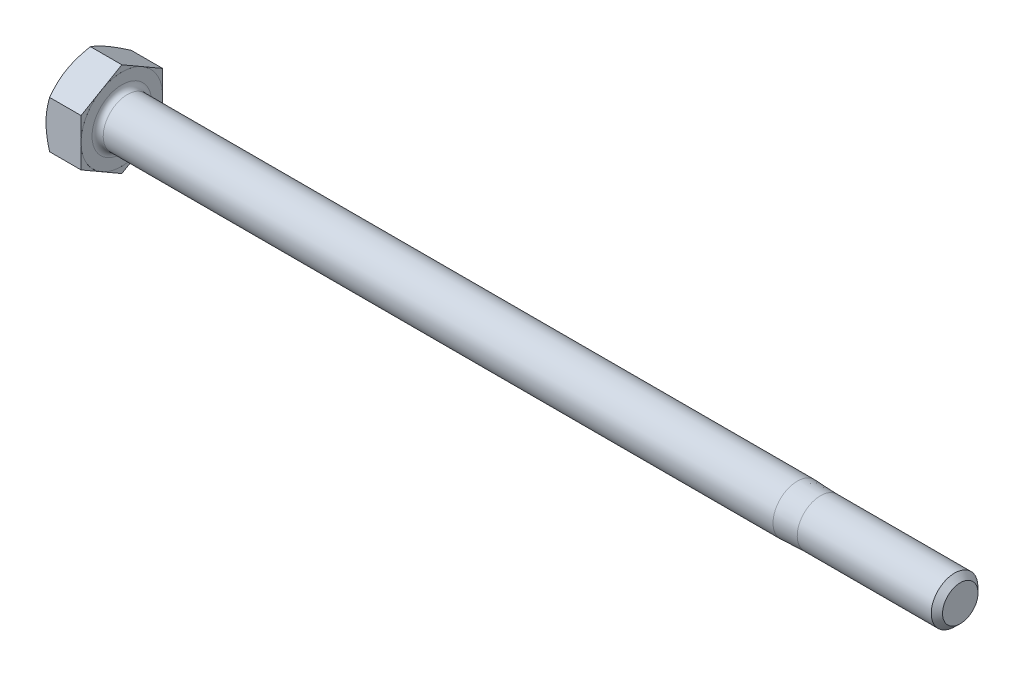
ISO-10303-21;
HEADER;
FILE_DESCRIPTION(('STEP AP214'),'2;1');
FILE_NAME('part.step','',(''),(''),'','','');
FILE_SCHEMA(('AUTOMOTIVE_DESIGN { 1 0 10303 214 1 1 1 1 }'));
ENDSEC;
DATA;
#1=APPLICATION_CONTEXT('core data for automotive mechanical design processes');
#2=APPLICATION_PROTOCOL_DEFINITION('international standard','automotive_design',2000,#1);
#3=PRODUCT_CONTEXT('',#1,'mechanical');
#4=PRODUCT('Part','Part','',(#3));
#5=PRODUCT_RELATED_PRODUCT_CATEGORY('part','',(#4));
#6=PRODUCT_DEFINITION_FORMATION('','',#4);
#7=PRODUCT_DEFINITION_CONTEXT('part definition',#1,'design');
#8=PRODUCT_DEFINITION('design','',#6,#7);
#9=PRODUCT_DEFINITION_SHAPE('','',#8);
#10=(LENGTH_UNIT() NAMED_UNIT(*) SI_UNIT(.MILLI.,.METRE.));
#11=(NAMED_UNIT(*) PLANE_ANGLE_UNIT() SI_UNIT($,.RADIAN.));
#12=(NAMED_UNIT(*) SI_UNIT($,.STERADIAN.) SOLID_ANGLE_UNIT());
#13=UNCERTAINTY_MEASURE_WITH_UNIT(LENGTH_MEASURE(1.E-05),#10,'distance_accuracy_value','');
#14=(GEOMETRIC_REPRESENTATION_CONTEXT(3) GLOBAL_UNCERTAINTY_ASSIGNED_CONTEXT((#13)) GLOBAL_UNIT_ASSIGNED_CONTEXT((#10,
#11,#12)) REPRESENTATION_CONTEXT('',''));
#15=CARTESIAN_POINT('',(0.,0.,0.));
#16=DIRECTION('',(0.,0.,1.));
#17=DIRECTION('',(1.,0.,0.));
#18=AXIS2_PLACEMENT_3D('',#15,#16,#17);
#19=CARTESIAN_POINT('',(-4.77529999999999,3.21156860739421,-5.5626));
#20=DIRECTION('',(0.,-0.866025403784439,0.499999999999999));
#21=DIRECTION('',(0.,-0.499999999999999,-0.866025403784439));
#22=AXIS2_PLACEMENT_3D('',#19,#20,#21);
#23=PLANE('',#22);
#24=CARTESIAN_POINT('',(-4.27840193892987,6.42325268484225,0.000200000000006919));
#25=CARTESIAN_POINT('',(-4.31915379774488,6.3526585812079,-0.122072574209484));
#26=CARTESIAN_POINT('',(-4.35805622469129,6.28180126837449,-0.244801040124756));
#27=CARTESIAN_POINT('',(-4.43165283843947,6.13951120287092,-0.491254662989237));
#28=CARTESIAN_POINT('',(-4.46634520986097,6.06807821602764,-0.614980225538191));
#29=CARTESIAN_POINT('',(-4.56342629893316,5.85263550648139,-0.988137944592613));
#30=CARTESIAN_POINT('',(-4.61864515807664,5.70777535201368,-1.23904309212295));
#31=CARTESIAN_POINT('',(-4.68339621381849,5.49099476252075,-1.61451808721945));
#32=CARTESIAN_POINT('',(-4.70184200165708,5.41972205873199,-1.73796603137439));
#33=CARTESIAN_POINT('',(-4.73277310833255,5.27685459691414,-1.98541973399131));
#34=CARTESIAN_POINT('',(-4.74525895381101,5.20525986790488,-2.10942544218947));
#35=CARTESIAN_POINT('',(-4.76395197006054,5.06194605565757,-2.3576522464282));
#36=CARTESIAN_POINT('',(-4.77016626659417,4.9902272065059,-2.48187293701927));
#37=CARTESIAN_POINT('',(-4.77618959935911,4.84672720555795,-2.73042222954729));
#38=CARTESIAN_POINT('',(-4.77599883344831,4.77494605575469,-2.85475082803224));
#39=CARTESIAN_POINT('',(-4.76667189863659,4.57828637012705,-3.19537539533984));
#40=CARTESIAN_POINT('',(-4.75101260446494,4.4534722013835,-3.41155987710815));
#41=CARTESIAN_POINT('',(-4.70135567661841,4.20467287416473,-3.84249295274001));
#42=CARTESIAN_POINT('',(-4.66734106857655,4.08068859075411,-4.05724003094722));
#43=CARTESIAN_POINT('',(-4.58231395859033,3.83138850679899,-4.48904044268869));
#44=CARTESIAN_POINT('',(-4.53094118606261,3.70610416511176,-4.70603928788378));
#45=CARTESIAN_POINT('',(-4.41434554300041,3.45740388365365,-5.13680081122591));
#46=CARTESIAN_POINT('',(-4.34915006238295,3.33398475856357,-5.35056900650763));
#47=CARTESIAN_POINT('',(-4.27840193892987,3.21145313734037,-5.56279999999999));
#48=B_SPLINE_CURVE_WITH_KNOTS('',3,(#24,#25,#26,#27,#28,#29,#30,#31,#32,#33,#34,#35,#36,#37,#38,
#39,#40,#41,#42,#43,#44,#45,#46,#47),.UNSPECIFIED.,.F.,.F.,(4,2,2,2,2,2,2,2,2,2,2,4),(0.,
0.44082011856227,0.881829648847399,1.76568130465016,2.19678242164486,2.62784543796583,
3.05841812523867,3.48897751176352,4.23854798324166,4.98881282275669,5.75571809391027,
6.52111769989992),.UNSPECIFIED.);
#49=CARTESIAN_POINT('',(-4.27846860739423,6.4231372147884,0.));
#50=VERTEX_POINT('',#49);
#51=CARTESIAN_POINT('',(-4.77530000000001,4.81735291109132,-2.7813));
#52=VERTEX_POINT('',#51);
#53=EDGE_CURVE('E226',#50,#52,#48,.T.);
#54=ORIENTED_EDGE('',*,*,#53,.F.);
#55=DIRECTION('',(1.,0.,0.));
#56=VECTOR('',#55,1.);
#57=CARTESIAN_POINT('',(-4.77529999999999,6.42313721478842,0.));
#58=LINE('',#57,#56);
#59=CARTESIAN_POINT('',(-9.99999999944363E-05,6.42313721478842,0.));
#60=VERTEX_POINT('',#59);
#61=EDGE_CURVE('E149',#50,#60,#58,.T.);
#62=ORIENTED_EDGE('',*,*,#61,.T.);
#63=DIRECTION('',(0.,-0.499999999999999,-0.866025403784439));
#64=VECTOR('',#63,1.);
#65=CARTESIAN_POINT('',(-9.99999999940308E-05,3.21156860739421,-5.5626));
#66=LINE('',#65,#64);
#67=CARTESIAN_POINT('',(-9.99999999942335E-05,4.81735291109131,-2.78129999999999));
#68=VERTEX_POINT('',#67);
#69=EDGE_CURVE('E233',#60,#68,#66,.T.);
#70=ORIENTED_EDGE('',*,*,#69,.T.);
#71=CARTESIAN_POINT('',(-9.99999999940308E-05,3.21156860739421,-5.5626));
#72=VERTEX_POINT('',#71);
#73=EDGE_CURVE('E312',#68,#72,#66,.T.);
#74=ORIENTED_EDGE('',*,*,#73,.T.);
#75=DIRECTION('',(1.,0.,0.));
#76=VECTOR('',#75,1.);
#77=CARTESIAN_POINT('',(-4.77529999999999,3.21156860739421,-5.5626));
#78=LINE('',#77,#76);
#79=CARTESIAN_POINT('',(-4.27846860739423,3.21156860739418,-5.5626));
#80=VERTEX_POINT('',#79);
#81=EDGE_CURVE('E160',#80,#72,#78,.T.);
#82=ORIENTED_EDGE('',*,*,#81,.F.);
#83=EDGE_CURVE('E219',#52,#80,#48,.T.);
#84=ORIENTED_EDGE('',*,*,#83,.F.);
#85=EDGE_LOOP('',(#54,#62,#70,#74,#82,#84));
#86=FACE_BOUND('',#85,.T.);
#87=ADVANCED_FACE('F36',(#86),#23,.F.);
#88=CARTESIAN_POINT('',(-4.77529999999999,-3.21156860739421,-5.5626));
#89=DIRECTION('',(0.,0.,1.));
#90=DIRECTION('',(0.,-1.,0.));
#91=AXIS2_PLACEMENT_3D('',#88,#89,#90);
#92=PLANE('',#91);
#93=CARTESIAN_POINT('',(-2.11344638926698,-8.51755521832246,-5.5626));
#94=CARTESIAN_POINT('',(-2.23147166166824,-8.27332555558046,-5.5626));
#95=CARTESIAN_POINT('',(-2.34832366508809,-8.02851845168018,-5.5626));
#96=CARTESIAN_POINT('',(-2.57901068864596,-7.53743714363392,-5.5626));
#97=CARTESIAN_POINT('',(-2.69284518642687,-7.29116269439858,-5.5626));
#98=CARTESIAN_POINT('',(-2.91742643995797,-6.79550412265191,-5.5626));
#99=CARTESIAN_POINT('',(-3.0281517979358,-6.54611026975771,-5.5626));
#100=CARTESIAN_POINT('',(-3.24484658870404,-6.0452727518282,-5.5626));
#101=CARTESIAN_POINT('',(-3.35081626939904,-5.79382919444944,-5.5626));
#102=CARTESIAN_POINT('',(-3.55799319026707,-5.28537094644158,-5.5626));
#103=CARTESIAN_POINT('',(-3.65912599046174,-5.02832575770978,-5.5626));
#104=CARTESIAN_POINT('',(-3.85347083747971,-4.51120331357714,-5.5626));
#105=CARTESIAN_POINT('',(-3.94668200306209,-4.25112572448762,-5.5626));
#106=CARTESIAN_POINT('',(-4.12267928100746,-3.72805980605447,-5.5626));
#107=CARTESIAN_POINT('',(-4.20548755698438,-3.46507900970405,-5.5626));
#108=CARTESIAN_POINT('',(-4.35798874636038,-2.93537607726828,-5.5626));
#109=CARTESIAN_POINT('',(-4.42768580730656,-2.66865515310524,-5.5626));
#110=CARTESIAN_POINT('',(-4.55058455470475,-2.13130259699166,-5.5626));
#111=CARTESIAN_POINT('',(-4.6037818465973,-1.86066994324131,-5.5626));
#112=CARTESIAN_POINT('',(-4.69008594291753,-1.31610382915986,-5.5626));
#113=CARTESIAN_POINT('',(-4.72319272959575,-1.04217036591281,-5.5626));
#114=CARTESIAN_POINT('',(-4.75566271940497,-0.630834239369238,-5.5626));
#115=CARTESIAN_POINT('',(-4.76362266525993,-0.494075453154336,-5.5626));
#116=CARTESIAN_POINT('',(-4.77374754815026,-0.220337235751522,-5.5626));
#117=CARTESIAN_POINT('',(-4.77591256044099,-0.0833578074520731,-5.5626));
#118=CARTESIAN_POINT('',(-4.77438941878322,0.190528860603805,-5.5626));
#119=CARTESIAN_POINT('',(-4.77070290750695,0.327436109830722,-5.5626));
#120=CARTESIAN_POINT('',(-4.75757014707673,0.600976342858242,-5.5626));
#121=CARTESIAN_POINT('',(-4.74812361028946,0.737609312620523,-5.5626));
#122=CARTESIAN_POINT('',(-4.71844421925849,1.06876539599823,-5.5626));
#123=CARTESIAN_POINT('',(-4.69532516171605,1.26303402663545,-5.5626));
#124=CARTESIAN_POINT('',(-4.63872521450843,1.65008267677664,-5.5626));
#125=CARTESIAN_POINT('',(-4.60524149659494,1.84286227522758,-5.5626));
#126=CARTESIAN_POINT('',(-4.52909973226012,2.22677375324305,-5.5626));
#127=CARTESIAN_POINT('',(-4.48643301145079,2.41790389592351,-5.5626));
#128=CARTESIAN_POINT('',(-4.3932270685715,2.79819772693412,-5.5626));
#129=CARTESIAN_POINT('',(-4.34268858812908,2.98736159872479,-5.5626));
#130=CARTESIAN_POINT('',(-4.23362712743804,3.36838194822663,-5.5626));
#131=CARTESIAN_POINT('',(-4.17493879567645,3.56019076914832,-5.5626));
#132=CARTESIAN_POINT('',(-4.05176338973037,3.94178098716688,-5.5626));
#133=CARTESIAN_POINT('',(-3.98728031517193,4.1315636830324,-5.5626));
#134=CARTESIAN_POINT('',(-3.85384738418795,4.50834012187714,-5.5626));
#135=CARTESIAN_POINT('',(-3.78492471276553,4.69534355027224,-5.56259999999999));
#136=CARTESIAN_POINT('',(-3.64303400403259,5.0678995201045,-5.56259999999999));
#137=CARTESIAN_POINT('',(-3.570064331722,5.25345144007258,-5.56259999999999));
#138=CARTESIAN_POINT('',(-3.49547149678627,5.43832927060622,-5.56259999999999));
#139=B_SPLINE_CURVE_WITH_KNOTS('',3,(#93,#94,#95,#96,#97,#98,#99,#100,#101,#102,#103,#104,#105,
#106,#107,#108,#109,#110,#111,#112,#113,#114,#115,#116,#117,#118,#119,#120,#121,#122,#123,#124,
#125,#126,#127,#128,#129,#130,#131,#132,#133,#134,#135,#136,#137,#138),.UNSPECIFIED.,.F.,.F.,(4,
2,2,2,2,2,2,2,2,2,2,2,2,2,2,2,2,2,2,2,2,2,4),(0.,0.813769390478702,1.6276787437096,
2.44624577284869,3.2647700819345,4.0933433300107,4.92200863225356,5.74887737059678,
6.5754840992548,7.402310798219,8.22913822766265,8.64000464573732,9.0508657281081,9.461611491668,
9.87237776795628,10.4589693289461,11.0457210969488,11.6330295703844,12.2202827447528,
12.8219307649627,13.4231666614523,14.021018397866,14.6191134529125),.UNSPECIFIED.);
#140=CARTESIAN_POINT('',(-4.77530000000001,0.,-5.5626));
#141=VERTEX_POINT('',#140);
#142=EDGE_CURVE('E227',#80,#141,#139,.F.);
#143=ORIENTED_EDGE('',*,*,#142,.F.);
#144=ORIENTED_EDGE('',*,*,#81,.T.);
#145=DIRECTION('',(0.,-1.,0.));
#146=VECTOR('',#145,1.);
#147=CARTESIAN_POINT('',(-9.99999999932197E-05,-3.21156860739421,-5.5626));
#148=LINE('',#147,#146);
#149=CARTESIAN_POINT('',(-9.99999999936252E-05,0.,-5.5626));
#150=VERTEX_POINT('',#149);
#151=EDGE_CURVE('E315',#72,#150,#148,.T.);
#152=ORIENTED_EDGE('',*,*,#151,.T.);
#153=CARTESIAN_POINT('',(-9.99999999932197E-05,-3.21156860739421,-5.5626));
#154=VERTEX_POINT('',#153);
#155=EDGE_CURVE('E317',#150,#154,#148,.T.);
#156=ORIENTED_EDGE('',*,*,#155,.T.);
#157=DIRECTION('',(1.,0.,0.));
#158=VECTOR('',#157,1.);
#159=CARTESIAN_POINT('',(-4.77529999999999,-3.21156860739421,-5.5626));
#160=LINE('',#159,#158);
#161=CARTESIAN_POINT('',(-4.27846860739423,-3.21156860739422,-5.56259999999997));
#162=VERTEX_POINT('',#161);
#163=EDGE_CURVE('E158',#162,#154,#160,.T.);
#164=ORIENTED_EDGE('',*,*,#163,.F.);
#165=EDGE_CURVE('E228',#141,#162,#139,.F.);
#166=ORIENTED_EDGE('',*,*,#165,.F.);
#167=EDGE_LOOP('',(#143,#144,#152,#156,#164,#166));
#168=FACE_BOUND('',#167,.T.);
#169=ADVANCED_FACE('F202',(#168),#92,.F.);
#170=CARTESIAN_POINT('',(-4.77529999999999,-6.42313721478842,0.));
#171=DIRECTION('',(0.,0.866025403784438,0.5));
#172=DIRECTION('',(0.,-0.500000000000001,0.866025403784438));
#173=AXIS2_PLACEMENT_3D('',#170,#171,#172);
#174=PLANE('',#173);
#175=CARTESIAN_POINT('',(-4.27840193892987,-3.21145313734037,-5.5628));
#176=CARTESIAN_POINT('',(-4.31915379774488,-3.28204724097473,-5.44052742579051));
#177=CARTESIAN_POINT('',(-4.35805622469129,-3.35290455380814,-5.31779895987524));
#178=CARTESIAN_POINT('',(-4.43165283843947,-3.49519461931171,-5.07134533701075));
#179=CARTESIAN_POINT('',(-4.46634520986097,-3.56662760615498,-4.9476197744618));
#180=CARTESIAN_POINT('',(-4.56342629893316,-3.78207031570124,-4.57446205540738));
#181=CARTESIAN_POINT('',(-4.61864515807664,-3.92693047016895,-4.32355690787704));
#182=CARTESIAN_POINT('',(-4.68339621381848,-4.14371105966188,-3.94808191278054));
#183=CARTESIAN_POINT('',(-4.70184200165708,-4.21498376345064,-3.8246339686256));
#184=CARTESIAN_POINT('',(-4.73277310833255,-4.35785122526849,-3.57718026600868));
#185=CARTESIAN_POINT('',(-4.745258953811,-4.42944595427775,-3.45317455781052));
#186=CARTESIAN_POINT('',(-4.76395197006054,-4.57275976652506,-3.20494775357179));
#187=CARTESIAN_POINT('',(-4.77016626659416,-4.64447861567673,-3.08072706298072));
#188=CARTESIAN_POINT('',(-4.77618959935911,-4.78797861662468,-2.8321777704527));
#189=CARTESIAN_POINT('',(-4.77599883344831,-4.85975976642794,-2.70784917196775));
#190=CARTESIAN_POINT('',(-4.76667189863659,-5.05641945205558,-2.36722460466015));
#191=CARTESIAN_POINT('',(-4.75101260446493,-5.18123362079913,-2.15104012289184));
#192=CARTESIAN_POINT('',(-4.7013556766184,-5.4300329480179,-1.72010704725999));
#193=CARTESIAN_POINT('',(-4.66734106857655,-5.55401723142852,-1.50535996905277));
#194=CARTESIAN_POINT('',(-4.58231395859033,-5.80331731538365,-1.07355955731131));
#195=CARTESIAN_POINT('',(-4.53094118606261,-5.92860165707087,-0.856560712116215));
#196=CARTESIAN_POINT('',(-4.41434554300041,-6.17730193852898,-0.425799188774088));
#197=CARTESIAN_POINT('',(-4.34915006238295,-6.30072106361906,-0.212030993492368));
#198=CARTESIAN_POINT('',(-4.27840193892987,-6.42325268484226,0.000199999999995457));
#199=B_SPLINE_CURVE_WITH_KNOTS('',3,(#175,#176,#177,#178,#179,#180,#181,#182,#183,#184,#185,
#186,#187,#188,#189,#190,#191,#192,#193,#194,#195,#196,#197,#198),.UNSPECIFIED.,.F.,.F.,(4,2,2,
2,2,2,2,2,2,2,2,4),(0.,0.440820118562269,0.881829648847399,1.76568130465016,2.19678242164486,
2.62784543796583,3.05841812523868,3.48897751176353,4.23854798324166,4.98881282275669,
5.75571809391026,6.52111769989991),.UNSPECIFIED.);
#200=CARTESIAN_POINT('',(-4.77530000000001,-4.81735291109132,-2.7813));
#201=VERTEX_POINT('',#200);
#202=EDGE_CURVE('E267',#162,#201,#199,.T.);
#203=ORIENTED_EDGE('',*,*,#202,.F.);
#204=ORIENTED_EDGE('',*,*,#163,.T.);
#205=DIRECTION('',(0.,-0.5,0.866025403784438));
#206=VECTOR('',#205,1.);
#207=CARTESIAN_POINT('',(-9.99999999928142E-05,-6.42313721478842,0.));
#208=LINE('',#207,#206);
#209=CARTESIAN_POINT('',(-9.99999999930169E-05,-4.81735291109131,-2.7813));
#210=VERTEX_POINT('',#209);
#211=EDGE_CURVE('E335',#154,#210,#208,.T.);
#212=ORIENTED_EDGE('',*,*,#211,.T.);
#213=CARTESIAN_POINT('',(-9.99999999928142E-05,-6.42313721478842,0.));
#214=VERTEX_POINT('',#213);
#215=EDGE_CURVE('E337',#210,#214,#208,.T.);
#216=ORIENTED_EDGE('',*,*,#215,.T.);
#217=DIRECTION('',(1.,0.,0.));
#218=VECTOR('',#217,1.);
#219=CARTESIAN_POINT('',(-4.77529999999999,-6.42313721478842,0.));
#220=LINE('',#219,#218);
#221=CARTESIAN_POINT('',(-4.27846860739423,-6.4231372147884,0.));
#222=VERTEX_POINT('',#221);
#223=EDGE_CURVE('E151',#222,#214,#220,.T.);
#224=ORIENTED_EDGE('',*,*,#223,.F.);
#225=EDGE_CURVE('E263',#201,#222,#199,.T.);
#226=ORIENTED_EDGE('',*,*,#225,.F.);
#227=EDGE_LOOP('',(#203,#204,#212,#216,#224,#226));
#228=FACE_BOUND('',#227,.T.);
#229=ADVANCED_FACE('F208',(#228),#174,.F.);
#230=CARTESIAN_POINT('',(-4.77529999999999,-3.21156860739421,5.56259999999999));
#231=DIRECTION('',(0.,0.866025403784439,-0.5));
#232=DIRECTION('',(0.,0.5,0.866025403784439));
#233=AXIS2_PLACEMENT_3D('',#230,#231,#232);
#234=PLANE('',#233);
#235=CARTESIAN_POINT('',(-4.27840193892987,-6.42325268484226,-0.000200000000004441));
#236=CARTESIAN_POINT('',(-4.31915379774488,-6.3526585812079,0.122072574209487));
#237=CARTESIAN_POINT('',(-4.35805622469129,-6.28180126837449,0.244801040124758));
#238=CARTESIAN_POINT('',(-4.43165283843947,-6.13951120287092,0.491254662989239));
#239=CARTESIAN_POINT('',(-4.46634520986097,-6.06807821602765,0.614980225538193));
#240=CARTESIAN_POINT('',(-4.56342629893316,-5.85263550648139,0.988137944592616));
#241=CARTESIAN_POINT('',(-4.61864515807664,-5.70777535201368,1.23904309212296));
#242=CARTESIAN_POINT('',(-4.68339621381848,-5.49099476252075,1.61451808721945));
#243=CARTESIAN_POINT('',(-4.70184200165708,-5.41972205873199,1.73796603137439));
#244=CARTESIAN_POINT('',(-4.73277310833255,-5.27685459691414,1.98541973399132));
#245=CARTESIAN_POINT('',(-4.74525895381101,-5.20525986790488,2.10942544218948));
#246=CARTESIAN_POINT('',(-4.76395197006054,-5.06194605565757,2.35765224642821));
#247=CARTESIAN_POINT('',(-4.77016626659416,-4.9902272065059,2.48187293701927));
#248=CARTESIAN_POINT('',(-4.77618959935911,-4.84672720555795,2.7304222295473));
#249=CARTESIAN_POINT('',(-4.77599883344831,-4.77494605575469,2.85475082803225));
#250=CARTESIAN_POINT('',(-4.76667189863659,-4.57828637012705,3.19537539533984));
#251=CARTESIAN_POINT('',(-4.75101260446493,-4.4534722013835,3.41155987710816));
#252=CARTESIAN_POINT('',(-4.7013556766184,-4.20467287416474,3.84249295274001));
#253=CARTESIAN_POINT('',(-4.66734106857655,-4.08068859075412,4.05724003094722));
#254=CARTESIAN_POINT('',(-4.58231395859033,-3.83138850679899,4.48904044268869));
#255=CARTESIAN_POINT('',(-4.53094118606261,-3.70610416511176,4.70603928788378));
#256=CARTESIAN_POINT('',(-4.41434554300041,-3.45740388365365,5.13680081122591));
#257=CARTESIAN_POINT('',(-4.34915006238295,-3.33398475856357,5.35056900650763));
#258=CARTESIAN_POINT('',(-4.27840193892987,-3.21145313734038,5.56279999999999));
#259=B_SPLINE_CURVE_WITH_KNOTS('',3,(#235,#236,#237,#238,#239,#240,#241,#242,#243,#244,#245,
#246,#247,#248,#249,#250,#251,#252,#253,#254,#255,#256,#257,#258),.UNSPECIFIED.,.F.,.F.,(4,2,2,
2,2,2,2,2,2,2,2,4),(0.,0.44082011856227,0.881829648847398,1.76568130465016,2.19678242164486,
2.62784543796583,3.05841812523868,3.48897751176352,4.23854798324166,4.98881282275669,
5.75571809391027,6.52111769989991),.UNSPECIFIED.);
#260=CARTESIAN_POINT('',(-4.77530000000001,-4.81735291109132,2.7813));
#261=VERTEX_POINT('',#260);
#262=EDGE_CURVE('E59',#222,#261,#259,.T.);
#263=ORIENTED_EDGE('',*,*,#262,.F.);
#264=ORIENTED_EDGE('',*,*,#223,.T.);
#265=DIRECTION('',(0.,0.5,0.866025403784439));
#266=VECTOR('',#265,1.);
#267=CARTESIAN_POINT('',(-9.99999999932197E-05,-3.21156860739421,5.56259999999999));
#268=LINE('',#267,#266);
#269=CARTESIAN_POINT('',(-9.99999999930169E-05,-4.81735291109132,2.78129999999999));
#270=VERTEX_POINT('',#269);
#271=EDGE_CURVE('E330',#214,#270,#268,.T.);
#272=ORIENTED_EDGE('',*,*,#271,.T.);
#273=CARTESIAN_POINT('',(-9.99999999932197E-05,-3.21156860739421,5.56259999999999));
#274=VERTEX_POINT('',#273);
#275=EDGE_CURVE('E328',#270,#274,#268,.T.);
#276=ORIENTED_EDGE('',*,*,#275,.T.);
#277=DIRECTION('',(1.,0.,0.));
#278=VECTOR('',#277,1.);
#279=CARTESIAN_POINT('',(-4.77529999999999,-3.21156860739421,5.56259999999999));
#280=LINE('',#279,#278);
#281=CARTESIAN_POINT('',(-4.27846860739423,-3.21156860739418,5.56259999999999));
#282=VERTEX_POINT('',#281);
#283=EDGE_CURVE('E148',#282,#274,#280,.T.);
#284=ORIENTED_EDGE('',*,*,#283,.F.);
#285=EDGE_CURVE('E258',#261,#282,#259,.T.);
#286=ORIENTED_EDGE('',*,*,#285,.F.);
#287=EDGE_LOOP('',(#263,#264,#272,#276,#284,#286));
#288=FACE_BOUND('',#287,.T.);
#289=ADVANCED_FACE('F270',(#288),#234,.F.);
#290=CARTESIAN_POINT('',(-4.77529999999999,3.2115686073942,5.5626));
#291=DIRECTION('',(0.,0.,-1.));
#292=DIRECTION('',(0.,1.,0.));
#293=AXIS2_PLACEMENT_3D('',#290,#291,#292);
#294=PLANE('',#293);
#295=CARTESIAN_POINT('',(-2.11344638926698,-8.51755521832247,5.56259999999999));
#296=CARTESIAN_POINT('',(-2.23147166166824,-8.27332555558047,5.56259999999999));
#297=CARTESIAN_POINT('',(-2.3483236650881,-8.02851845168018,5.56259999999999));
#298=CARTESIAN_POINT('',(-2.57901068864596,-7.53743714363393,5.56259999999999));
#299=CARTESIAN_POINT('',(-2.69284518642687,-7.29116269439858,5.56259999999999));
#300=CARTESIAN_POINT('',(-2.91742643995797,-6.79550412265191,5.56259999999999));
#301=CARTESIAN_POINT('',(-3.0281517979358,-6.54611026975771,5.56259999999999));
#302=CARTESIAN_POINT('',(-3.24484658870404,-6.0452727518282,5.56259999999999));
#303=CARTESIAN_POINT('',(-3.35081626939904,-5.79382919444945,5.56259999999999));
#304=CARTESIAN_POINT('',(-3.55799319026707,-5.28537094644159,5.56259999999999));
#305=CARTESIAN_POINT('',(-3.65912599046174,-5.02832575770978,5.56259999999999));
#306=CARTESIAN_POINT('',(-3.85347083747971,-4.51120331357715,5.56259999999999));
#307=CARTESIAN_POINT('',(-3.94668200306209,-4.25112572448762,5.56259999999999));
#308=CARTESIAN_POINT('',(-4.12267928100746,-3.72805980605448,5.56259999999999));
#309=CARTESIAN_POINT('',(-4.20548755698438,-3.46507900970406,5.56259999999999));
#310=CARTESIAN_POINT('',(-4.35798874636038,-2.93537607726828,5.56259999999999));
#311=CARTESIAN_POINT('',(-4.42768580730656,-2.66865515310525,5.56259999999999));
#312=CARTESIAN_POINT('',(-4.55058455470475,-2.13130259699167,5.56259999999999));
#313=CARTESIAN_POINT('',(-4.6037818465973,-1.86066994324131,5.56259999999999));
#314=CARTESIAN_POINT('',(-4.69008594291753,-1.31610382915987,5.56259999999999));
#315=CARTESIAN_POINT('',(-4.72319272959575,-1.04217036591282,5.56259999999999));
#316=CARTESIAN_POINT('',(-4.75566271940497,-0.630834239369243,5.56259999999999));
#317=CARTESIAN_POINT('',(-4.76362266525993,-0.494075453154342,5.56259999999999));
#318=CARTESIAN_POINT('',(-4.77374754815026,-0.220337235751528,5.56259999999999));
#319=CARTESIAN_POINT('',(-4.77591256044099,-0.0833578074520796,5.56259999999999));
#320=CARTESIAN_POINT('',(-4.77438941878322,0.190528860603799,5.56259999999999));
#321=CARTESIAN_POINT('',(-4.77070290750695,0.327436109830716,5.56259999999999));
#322=CARTESIAN_POINT('',(-4.75757014707673,0.600976342858236,5.56259999999999));
#323=CARTESIAN_POINT('',(-4.74812361028946,0.737609312620516,5.5626));
#324=CARTESIAN_POINT('',(-4.71844421925849,1.06876539599822,5.5626));
#325=CARTESIAN_POINT('',(-4.69532516171605,1.26303402663544,5.5626));
#326=CARTESIAN_POINT('',(-4.63872521450843,1.65008267677663,5.5626));
#327=CARTESIAN_POINT('',(-4.60524149659494,1.84286227522757,5.5626));
#328=CARTESIAN_POINT('',(-4.52909973226012,2.22677375324304,5.5626));
#329=CARTESIAN_POINT('',(-4.48643301145079,2.4179038959235,5.5626));
#330=CARTESIAN_POINT('',(-4.3932270685715,2.79819772693411,5.5626));
#331=CARTESIAN_POINT('',(-4.34268858812908,2.98736159872479,5.5626));
#332=CARTESIAN_POINT('',(-4.23362712743804,3.36838194822662,5.5626));
#333=CARTESIAN_POINT('',(-4.17493879567645,3.56019076914831,5.5626));
#334=CARTESIAN_POINT('',(-4.05176338973038,3.94178098716687,5.5626));
#335=CARTESIAN_POINT('',(-3.98728031517193,4.13156368303239,5.5626));
#336=CARTESIAN_POINT('',(-3.85384738418795,4.50834012187714,5.5626));
#337=CARTESIAN_POINT('',(-3.78492471276553,4.69534355027224,5.5626));
#338=CARTESIAN_POINT('',(-3.64303400403259,5.0678995201045,5.5626));
#339=CARTESIAN_POINT('',(-3.570064331722,5.25345144007257,5.5626));
#340=CARTESIAN_POINT('',(-3.49547149678627,5.43832927060621,5.5626));
#341=B_SPLINE_CURVE_WITH_KNOTS('',3,(#295,#296,#297,#298,#299,#300,#301,#302,#303,#304,#305,
#306,#307,#308,#309,#310,#311,#312,#313,#314,#315,#316,#317,#318,#319,#320,#321,#322,#323,#324,
#325,#326,#327,#328,#329,#330,#331,#332,#333,#334,#335,#336,#337,#338,#339,#340),.UNSPECIFIED.,
.F.,.F.,(4,2,2,2,2,2,2,2,2,2,2,2,2,2,2,2,2,2,2,2,2,2,4),(0.,0.813769390478702,1.6276787437096,
2.44624577284869,3.2647700819345,4.0933433300107,4.92200863225356,5.74887737059678,
6.57548409925479,7.402310798219,8.22913822766265,8.64000464573732,9.05086572810809,
9.461611491668,9.87237776795628,10.4589693289461,11.0457210969488,11.6330295703844,
12.2202827447528,12.8219307649627,13.4231666614523,14.021018397866,14.6191134529125),.UNSPECIFIED.);
#342=CARTESIAN_POINT('',(-4.77530000000001,0.,5.5626));
#343=VERTEX_POINT('',#342);
#344=EDGE_CURVE('E51',#282,#343,#341,.T.);
#345=ORIENTED_EDGE('',*,*,#344,.F.);
#346=ORIENTED_EDGE('',*,*,#283,.T.);
#347=DIRECTION('',(0.,1.,0.));
#348=VECTOR('',#347,1.);
#349=CARTESIAN_POINT('',(-9.99999999940308E-05,3.2115686073942,5.5626));
#350=LINE('',#349,#348);
#351=CARTESIAN_POINT('',(-9.99999999936252E-05,0.,5.56259999999999));
#352=VERTEX_POINT('',#351);
#353=EDGE_CURVE('E326',#274,#352,#350,.T.);
#354=ORIENTED_EDGE('',*,*,#353,.T.);
#355=CARTESIAN_POINT('',(-9.99999999940308E-05,3.2115686073942,5.5626));
#356=VERTEX_POINT('',#355);
#357=EDGE_CURVE('E146',#352,#356,#350,.T.);
#358=ORIENTED_EDGE('',*,*,#357,.T.);
#359=DIRECTION('',(1.,0.,0.));
#360=VECTOR('',#359,1.);
#361=CARTESIAN_POINT('',(-4.77529999999999,3.2115686073942,5.5626));
#362=LINE('',#361,#360);
#363=CARTESIAN_POINT('',(-4.27846860739423,3.21156860739422,5.56259999999997));
#364=VERTEX_POINT('',#363);
#365=EDGE_CURVE('E138',#364,#356,#362,.T.);
#366=ORIENTED_EDGE('',*,*,#365,.F.);
#367=EDGE_CURVE('E126',#343,#364,#341,.T.);
#368=ORIENTED_EDGE('',*,*,#367,.F.);
#369=EDGE_LOOP('',(#345,#346,#354,#358,#366,#368));
#370=FACE_BOUND('',#369,.T.);
#371=ADVANCED_FACE('F143',(#370),#294,.F.);
#372=CARTESIAN_POINT('',(-4.77529999999999,6.42313721478842,0.));
#373=DIRECTION('',(0.,-0.866025403784438,-0.500000000000001));
#374=DIRECTION('',(0.,0.500000000000001,-0.866025403784438));
#375=AXIS2_PLACEMENT_3D('',#372,#373,#374);
#376=PLANE('',#375);
#377=CARTESIAN_POINT('',(-4.27840193892987,3.21145313734037,5.5628));
#378=CARTESIAN_POINT('',(-4.31915379774488,3.28204724097472,5.44052742579051));
#379=CARTESIAN_POINT('',(-4.35805622469129,3.35290455380814,5.31779895987524));
#380=CARTESIAN_POINT('',(-4.43165283843947,3.4951946193117,5.07134533701075));
#381=CARTESIAN_POINT('',(-4.46634520986097,3.56662760615498,4.9476197744618));
#382=CARTESIAN_POINT('',(-4.56342629893316,3.78207031570124,4.57446205540738));
#383=CARTESIAN_POINT('',(-4.61864515807664,3.92693047016894,4.32355690787704));
#384=CARTESIAN_POINT('',(-4.68339621381849,4.14371105966188,3.94808191278054));
#385=CARTESIAN_POINT('',(-4.70184200165708,4.21498376345064,3.8246339686256));
#386=CARTESIAN_POINT('',(-4.73277310833255,4.35785122526849,3.57718026600868));
#387=CARTESIAN_POINT('',(-4.74525895381101,4.42944595427775,3.45317455781052));
#388=CARTESIAN_POINT('',(-4.76395197006054,4.57275976652506,3.20494775357179));
#389=CARTESIAN_POINT('',(-4.77016626659417,4.64447861567673,3.08072706298072));
#390=CARTESIAN_POINT('',(-4.77618959935911,4.78797861662468,2.8321777704527));
#391=CARTESIAN_POINT('',(-4.77599883344831,4.85975976642793,2.70784917196775));
#392=CARTESIAN_POINT('',(-4.76667189863659,5.05641945205557,2.36722460466015));
#393=CARTESIAN_POINT('',(-4.75101260446494,5.18123362079913,2.15104012289184));
#394=CARTESIAN_POINT('',(-4.70135567661841,5.43003294801789,1.72010704725999));
#395=CARTESIAN_POINT('',(-4.66734106857655,5.55401723142851,1.50535996905278));
#396=CARTESIAN_POINT('',(-4.58231395859033,5.80331731538364,1.07355955731131));
#397=CARTESIAN_POINT('',(-4.53094118606261,5.92860165707086,0.856560712116217));
#398=CARTESIAN_POINT('',(-4.41434554300042,6.17730193852898,0.425799188774089));
#399=CARTESIAN_POINT('',(-4.34915006238295,6.30072106361906,0.212030993492369));
#400=CARTESIAN_POINT('',(-4.27840193892987,6.42325268484225,-0.000199999999993345));
#401=B_SPLINE_CURVE_WITH_KNOTS('',3,(#377,#378,#379,#380,#381,#382,#383,#384,#385,#386,#387,
#388,#389,#390,#391,#392,#393,#394,#395,#396,#397,#398,#399,#400),.UNSPECIFIED.,.F.,.F.,(4,2,2,
2,2,2,2,2,2,2,2,4),(0.,0.44082011856227,0.881829648847399,1.76568130465016,2.19678242164486,
2.62784543796583,3.05841812523867,3.48897751176352,4.23854798324166,4.98881282275669,
5.75571809391026,6.52111769989991),.UNSPECIFIED.);
#402=CARTESIAN_POINT('',(-4.77529999999999,4.81735291109131,2.7813));
#403=VERTEX_POINT('',#402);
#404=EDGE_CURVE('E129',#364,#403,#401,.T.);
#405=ORIENTED_EDGE('',*,*,#404,.F.);
#406=ORIENTED_EDGE('',*,*,#365,.T.);
#407=DIRECTION('',(0.,0.500000000000001,-0.866025403784438));
#408=VECTOR('',#407,1.);
#409=CARTESIAN_POINT('',(-9.99999999944363E-05,6.42313721478842,0.));
#410=LINE('',#409,#408);
#411=CARTESIAN_POINT('',(-9.99999999896061E-05,4.81735291109131,2.7813));
#412=VERTEX_POINT('',#411);
#413=EDGE_CURVE('E153',#356,#412,#410,.T.);
#414=ORIENTED_EDGE('',*,*,#413,.T.);
#415=EDGE_CURVE('E307',#412,#60,#410,.T.);
#416=ORIENTED_EDGE('',*,*,#415,.T.);
#417=ORIENTED_EDGE('',*,*,#61,.F.);
#418=EDGE_CURVE('E141',#403,#50,#401,.T.);
#419=ORIENTED_EDGE('',*,*,#418,.F.);
#420=EDGE_LOOP('',(#405,#406,#414,#416,#417,#419));
#421=FACE_BOUND('',#420,.T.);
#422=ADVANCED_FACE('F137',(#421),#376,.F.);
#423=CARTESIAN_POINT('',(114.3,0.,0.));
#424=DIRECTION('',(1.,0.,0.));
#425=DIRECTION('',(0.,1.,0.));
#426=AXIS2_PLACEMENT_3D('',#423,#424,#425);
#427=PLANE('',#426);
#428=CARTESIAN_POINT('',(114.3,0.,0.));
#429=DIRECTION('',(1.,0.,0.));
#430=DIRECTION('',(0.,1.,0.));
#431=AXIS2_PLACEMENT_3D('',#428,#429,#430);
#432=CIRCLE('',#431,2.41925000000001);
#433=CARTESIAN_POINT('',(114.3,2.41925000000002,0.));
#434=VERTEX_POINT('',#433);
#435=EDGE_CURVE('E181',#434,#434,#432,.T.);
#436=ORIENTED_EDGE('',*,*,#435,.T.);
#437=EDGE_LOOP('',(#436));
#438=FACE_BOUND('',#437,.T.);
#439=ADVANCED_FACE('F279',(#438),#427,.T.);
#440=CARTESIAN_POINT('',(114.3,0.,0.));
#441=DIRECTION('',(1.,0.,0.));
#442=DIRECTION('',(0.,1.,0.));
#443=AXIS2_PLACEMENT_3D('',#440,#441,#442);
#444=CYLINDRICAL_SURFACE('',#443,3.17500000000001);
#445=CARTESIAN_POINT('',(113.5209185,0.,0.));
#446=DIRECTION('',(1.,0.,0.));
#447=DIRECTION('',(0.,1.,0.));
#448=AXIS2_PLACEMENT_3D('',#445,#446,#447);
#449=CIRCLE('',#448,3.17500000000001);
#450=CARTESIAN_POINT('',(113.5209185,3.17500000000002,0.));
#451=VERTEX_POINT('',#450);
#452=EDGE_CURVE('E184',#451,#451,#449,.F.);
#453=ORIENTED_EDGE('',*,*,#452,.T.);
#454=EDGE_LOOP('',(#453));
#455=FACE_BOUND('',#454,.T.);
#456=CARTESIAN_POINT('',(95.25,0.,0.));
#457=DIRECTION('',(1.,0.,0.));
#458=DIRECTION('',(0.,1.,0.));
#459=AXIS2_PLACEMENT_3D('',#456,#457,#458);
#460=CIRCLE('',#459,3.17500000000001);
#461=CARTESIAN_POINT('',(95.25,3.17500000000002,0.));
#462=VERTEX_POINT('',#461);
#463=EDGE_CURVE('E173',#462,#462,#460,.T.);
#464=ORIENTED_EDGE('',*,*,#463,.T.);
#465=EDGE_LOOP('',(#464));
#466=FACE_BOUND('',#465,.T.);
#467=ADVANCED_FACE('F473',(#455,#466),#444,.T.);
#468=CARTESIAN_POINT('',(95.25,0.,0.));
#469=DIRECTION('',(-1.,0.,0.));
#470=DIRECTION('',(0.,-1.,0.));
#471=AXIS2_PLACEMENT_3D('',#468,#469,#470);
#472=CONICAL_SURFACE('',#471,3.17500000000001,0.0399774293328535);
#473=CARTESIAN_POINT('',(92.0749,0.,0.));
#474=DIRECTION('',(1.,0.,0.));
#475=DIRECTION('',(0.,1.,0.));
#476=AXIS2_PLACEMENT_3D('',#473,#474,#475);
#477=CIRCLE('',#476,3.30200000000002);
#478=CARTESIAN_POINT('',(92.0749,3.30200000000003,0.));
#479=VERTEX_POINT('',#478);
#480=EDGE_CURVE('E170',#479,#479,#477,.T.);
#481=ORIENTED_EDGE('',*,*,#480,.T.);
#482=EDGE_LOOP('',(#481));
#483=FACE_BOUND('',#482,.T.);
#484=ORIENTED_EDGE('',*,*,#463,.F.);
#485=EDGE_LOOP('',(#484));
#486=FACE_BOUND('',#485,.T.);
#487=ADVANCED_FACE('F485',(#483,#486),#472,.T.);
#488=CARTESIAN_POINT('',(114.3,0.,0.));
#489=DIRECTION('',(1.,0.,0.));
#490=DIRECTION('',(0.,1.,0.));
#491=AXIS2_PLACEMENT_3D('',#488,#489,#490);
#492=CYLINDRICAL_SURFACE('',#491,3.30199999999977);
#493=CARTESIAN_POINT('',(0.761999999999999,0.,0.));
#494=DIRECTION('',(1.,0.,0.));
#495=DIRECTION('',(0.,1.,0.));
#496=AXIS2_PLACEMENT_3D('',#493,#494,#495);
#497=CIRCLE('',#496,3.30199999999977);
#498=CARTESIAN_POINT('',(0.761999999999998,3.30199999999977,0.));
#499=VERTEX_POINT('',#498);
#500=EDGE_CURVE('E44',#499,#499,#497,.T.);
#501=ORIENTED_EDGE('',*,*,#500,.T.);
#502=EDGE_LOOP('',(#501));
#503=FACE_BOUND('',#502,.T.);
#504=ORIENTED_EDGE('',*,*,#480,.F.);
#505=EDGE_LOOP('',(#504));
#506=FACE_BOUND('',#505,.T.);
#507=ADVANCED_FACE('F189',(#503,#506),#492,.T.);
#508=CARTESIAN_POINT('',(0.,3.30199999999952,0.));
#509=DIRECTION('',(1.,0.,0.));
#510=DIRECTION('',(0.,1.,0.));
#511=AXIS2_PLACEMENT_3D('',#508,#509,#510);
#512=PLANE('',#511);
#513=CARTESIAN_POINT('',(0.,0.,0.));
#514=DIRECTION('',(1.,0.,0.));
#515=DIRECTION('',(0.,1.,0.));
#516=AXIS2_PLACEMENT_3D('',#513,#514,#515);
#517=CIRCLE('',#516,4.06399999999977);
#518=CARTESIAN_POINT('',(0.,4.06399999999977,0.));
#519=VERTEX_POINT('',#518);
#520=EDGE_CURVE('E11',#519,#519,#517,.F.);
#521=ORIENTED_EDGE('',*,*,#520,.T.);
#522=EDGE_LOOP('',(#521));
#523=FACE_BOUND('',#522,.T.);
#524=CARTESIAN_POINT('',(0.,0.,0.));
#525=DIRECTION('',(1.,0.,0.));
#526=DIRECTION('',(0.,1.,0.));
#527=AXIS2_PLACEMENT_3D('',#524,#525,#526);
#528=CIRCLE('',#527,5.5626);
#529=CARTESIAN_POINT('',(0.,5.5626,0.));
#530=VERTEX_POINT('',#529);
#531=EDGE_CURVE('E166',#530,#530,#528,.T.);
#532=ORIENTED_EDGE('',*,*,#531,.T.);
#533=EDGE_LOOP('',(#532));
#534=FACE_BOUND('',#533,.T.);
#535=ADVANCED_FACE('F290',(#523,#534),#512,.T.);
#536=CARTESIAN_POINT('',(114.3,0.,0.));
#537=DIRECTION('',(1.,0.,0.));
#538=DIRECTION('',(0.,1.,0.));
#539=AXIS2_PLACEMENT_3D('',#536,#537,#538);
#540=CYLINDRICAL_SURFACE('',#539,5.5626);
#541=CARTESIAN_POINT('',(-9.99999999889978E-05,0.,0.));
#542=DIRECTION('',(1.,0.,0.));
#543=DIRECTION('',(0.,1.,0.));
#544=AXIS2_PLACEMENT_3D('',#541,#542,#543);
#545=CIRCLE('',#544,5.5626);
#546=EDGE_CURVE('E163',#412,#352,#545,.T.);
#547=ORIENTED_EDGE('',*,*,#546,.T.);
#548=EDGE_CURVE('E167',#352,#270,#545,.T.);
#549=ORIENTED_EDGE('',*,*,#548,.T.);
#550=EDGE_CURVE('E322',#270,#210,#545,.T.);
#551=ORIENTED_EDGE('',*,*,#550,.T.);
#552=EDGE_CURVE('E321',#210,#150,#545,.T.);
#553=ORIENTED_EDGE('',*,*,#552,.T.);
#554=EDGE_CURVE('E309',#150,#68,#545,.T.);
#555=ORIENTED_EDGE('',*,*,#554,.T.);
#556=EDGE_CURVE('E162',#68,#412,#545,.T.);
#557=ORIENTED_EDGE('',*,*,#556,.T.);
#558=EDGE_LOOP('',(#547,#549,#551,#553,#555,#557));
#559=FACE_BOUND('',#558,.T.);
#560=ORIENTED_EDGE('',*,*,#531,.F.);
#561=EDGE_LOOP('',(#560));
#562=FACE_BOUND('',#561,.T.);
#563=ADVANCED_FACE('F216',(#559,#562),#540,.T.);
#564=CARTESIAN_POINT('',(-9.99999999936252E-05,0.,0.));
#565=DIRECTION('',(1.,0.,0.));
#566=DIRECTION('',(0.,1.,0.));
#567=AXIS2_PLACEMENT_3D('',#564,#565,#566);
#568=PLANE('',#567);
#569=ORIENTED_EDGE('',*,*,#546,.F.);
#570=ORIENTED_EDGE('',*,*,#413,.F.);
#571=ORIENTED_EDGE('',*,*,#357,.F.);
#572=EDGE_LOOP('',(#569,#570,#571));
#573=FACE_BOUND('',#572,.T.);
#574=ADVANCED_FACE('F280',(#573),#568,.T.);
#575=ORIENTED_EDGE('',*,*,#548,.F.);
#576=ORIENTED_EDGE('',*,*,#353,.F.);
#577=ORIENTED_EDGE('',*,*,#275,.F.);
#578=EDGE_LOOP('',(#575,#576,#577));
#579=FACE_BOUND('',#578,.T.);
#580=ADVANCED_FACE('F282',(#579),#568,.T.);
#581=ORIENTED_EDGE('',*,*,#550,.F.);
#582=ORIENTED_EDGE('',*,*,#271,.F.);
#583=ORIENTED_EDGE('',*,*,#215,.F.);
#584=EDGE_LOOP('',(#581,#582,#583));
#585=FACE_BOUND('',#584,.T.);
#586=ADVANCED_FACE('F288',(#585),#568,.T.);
#587=ORIENTED_EDGE('',*,*,#552,.F.);
#588=ORIENTED_EDGE('',*,*,#211,.F.);
#589=ORIENTED_EDGE('',*,*,#155,.F.);
#590=EDGE_LOOP('',(#587,#588,#589));
#591=FACE_BOUND('',#590,.T.);
#592=ADVANCED_FACE('F299',(#591),#568,.T.);
#593=ORIENTED_EDGE('',*,*,#554,.F.);
#594=ORIENTED_EDGE('',*,*,#151,.F.);
#595=ORIENTED_EDGE('',*,*,#73,.F.);
#596=EDGE_LOOP('',(#593,#594,#595));
#597=FACE_BOUND('',#596,.T.);
#598=ADVANCED_FACE('F294',(#597),#568,.T.);
#599=ORIENTED_EDGE('',*,*,#556,.F.);
#600=ORIENTED_EDGE('',*,*,#69,.F.);
#601=ORIENTED_EDGE('',*,*,#415,.F.);
#602=EDGE_LOOP('',(#599,#600,#601));
#603=FACE_BOUND('',#602,.T.);
#604=ADVANCED_FACE('F240',(#603),#568,.T.);
#605=CARTESIAN_POINT('',(-4.77530000000001,0.,0.));
#606=DIRECTION('',(1.,0.,0.));
#607=DIRECTION('',(0.,0.,-1.));
#608=AXIS2_PLACEMENT_3D('',#605,#606,#607);
#609=CONICAL_SURFACE('',#608,5.5626,1.0471975511966);
#610=ORIENTED_EDGE('',*,*,#53,.T.);
#611=CARTESIAN_POINT('',(-4.77529999999999,0.,0.));
#612=DIRECTION('',(1.,0.,0.));
#613=DIRECTION('',(0.,1.,0.));
#614=AXIS2_PLACEMENT_3D('',#611,#612,#613);
#615=CIRCLE('',#614,5.56260000000003);
#616=EDGE_CURVE('E176',#52,#403,#615,.T.);
#617=ORIENTED_EDGE('',*,*,#616,.T.);
#618=ORIENTED_EDGE('',*,*,#418,.T.);
#619=EDGE_LOOP('',(#610,#617,#618));
#620=FACE_BOUND('',#619,.T.);
#621=ADVANCED_FACE('F235',(#620),#609,.T.);
#622=ORIENTED_EDGE('',*,*,#83,.T.);
#623=ORIENTED_EDGE('',*,*,#142,.T.);
#624=EDGE_CURVE('E179',#141,#52,#615,.T.);
#625=ORIENTED_EDGE('',*,*,#624,.T.);
#626=EDGE_LOOP('',(#622,#623,#625));
#627=FACE_BOUND('',#626,.T.);
#628=ADVANCED_FACE('F239',(#627),#609,.T.);
#629=ORIENTED_EDGE('',*,*,#165,.T.);
#630=ORIENTED_EDGE('',*,*,#202,.T.);
#631=EDGE_CURVE('E357',#201,#141,#615,.T.);
#632=ORIENTED_EDGE('',*,*,#631,.T.);
#633=EDGE_LOOP('',(#629,#630,#632));
#634=FACE_BOUND('',#633,.T.);
#635=ADVANCED_FACE('F358',(#634),#609,.T.);
#636=ORIENTED_EDGE('',*,*,#225,.T.);
#637=ORIENTED_EDGE('',*,*,#262,.T.);
#638=EDGE_CURVE('E361',#261,#201,#615,.T.);
#639=ORIENTED_EDGE('',*,*,#638,.T.);
#640=EDGE_LOOP('',(#636,#637,#639));
#641=FACE_BOUND('',#640,.T.);
#642=ADVANCED_FACE('F364',(#641),#609,.T.);
#643=ORIENTED_EDGE('',*,*,#285,.T.);
#644=ORIENTED_EDGE('',*,*,#344,.T.);
#645=EDGE_CURVE('E180',#343,#261,#615,.T.);
#646=ORIENTED_EDGE('',*,*,#645,.T.);
#647=EDGE_LOOP('',(#643,#644,#646));
#648=FACE_BOUND('',#647,.T.);
#649=ADVANCED_FACE('F365',(#648),#609,.T.);
#650=ORIENTED_EDGE('',*,*,#367,.T.);
#651=ORIENTED_EDGE('',*,*,#404,.T.);
#652=CARTESIAN_POINT('',(-4.77530000000001,0.,0.));
#653=DIRECTION('',(-1.,0.,0.));
#654=DIRECTION('',(0.,0.,1.));
#655=AXIS2_PLACEMENT_3D('',#652,#653,#654);
#656=CIRCLE('',#655,5.5626);
#657=EDGE_CURVE('E131',#343,#403,#656,.T.);
#658=ORIENTED_EDGE('',*,*,#657,.F.);
#659=EDGE_LOOP('',(#650,#651,#658));
#660=FACE_BOUND('',#659,.T.);
#661=ADVANCED_FACE('F128',(#660),#609,.T.);
#662=CARTESIAN_POINT('',(-4.77529999999999,0.,0.));
#663=DIRECTION('',(1.,0.,0.));
#664=DIRECTION('',(0.,1.,0.));
#665=AXIS2_PLACEMENT_3D('',#662,#663,#664);
#666=PLANE('',#665);
#667=ORIENTED_EDGE('',*,*,#657,.T.);
#668=ORIENTED_EDGE('',*,*,#616,.F.);
#669=ORIENTED_EDGE('',*,*,#624,.F.);
#670=ORIENTED_EDGE('',*,*,#631,.F.);
#671=ORIENTED_EDGE('',*,*,#638,.F.);
#672=ORIENTED_EDGE('',*,*,#645,.F.);
#673=EDGE_LOOP('',(#667,#668,#669,#670,#671,#672));
#674=FACE_BOUND('',#673,.T.);
#675=ADVANCED_FACE('F198',(#674),#666,.F.);
#676=CARTESIAN_POINT('',(114.3,0.,0.));
#677=DIRECTION('',(-1.,0.,0.));
#678=DIRECTION('',(0.,-1.,0.));
#679=AXIS2_PLACEMENT_3D('',#676,#677,#678);
#680=CONICAL_SURFACE('',#679,2.41925000000001,0.770197991199368);
#681=ORIENTED_EDGE('',*,*,#452,.F.);
#682=EDGE_LOOP('',(#681));
#683=FACE_BOUND('',#682,.T.);
#684=ORIENTED_EDGE('',*,*,#435,.F.);
#685=EDGE_LOOP('',(#684));
#686=FACE_BOUND('',#685,.T.);
#687=ADVANCED_FACE('F193',(#683,#686),#680,.T.);
#688=CARTESIAN_POINT('',(0.761999999999999,0.,0.));
#689=DIRECTION('',(1.,0.,0.));
#690=DIRECTION('',(0.,1.,0.));
#691=AXIS2_PLACEMENT_3D('',#688,#689,#690);
#692=TOROIDAL_SURFACE('',#691,4.06399999999977,0.762);
#693=ORIENTED_EDGE('',*,*,#520,.F.);
#694=EDGE_LOOP('',(#693));
#695=FACE_BOUND('',#694,.T.);
#696=ORIENTED_EDGE('',*,*,#500,.F.);
#697=EDGE_LOOP('',(#696));
#698=FACE_BOUND('',#697,.T.);
#699=ADVANCED_FACE('F38',(#695,#698),#692,.F.);
#700=CLOSED_SHELL('',(#87,#169,#229,#289,#371,#422,#439,#467,#487,#507,#535,#563,#574,#580,#586,
#592,#598,#604,#621,#628,#635,#642,#649,#661,#675,#687,#699));
#701=MANIFOLD_SOLID_BREP('B2',#700);
#702=ADVANCED_BREP_SHAPE_REPRESENTATION('',(#18,#701),#14);
#703=SHAPE_DEFINITION_REPRESENTATION(#9,#702);
ENDSEC;
END-ISO-10303-21;
